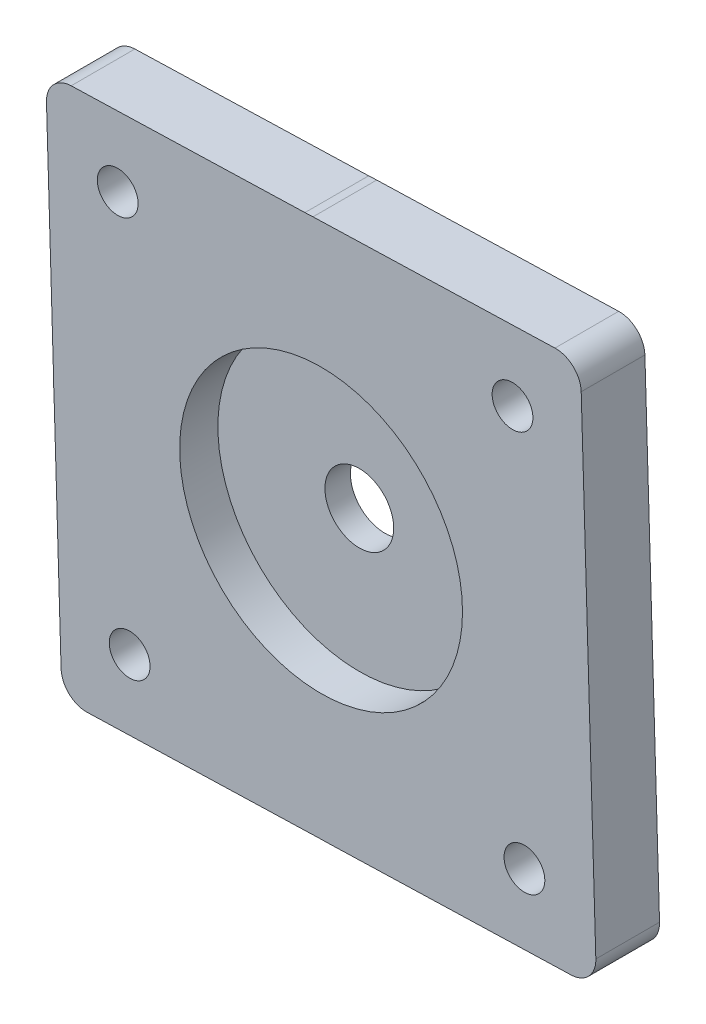
ISO-10303-21;
HEADER;
FILE_DESCRIPTION(('STEP AP214'),'2;1');
FILE_NAME('part.step','',(''),(''),'','','');
FILE_SCHEMA(('AUTOMOTIVE_DESIGN { 1 0 10303 214 1 1 1 1 }'));
ENDSEC;
DATA;
#1=APPLICATION_CONTEXT('core data for automotive mechanical design processes');
#2=APPLICATION_PROTOCOL_DEFINITION('international standard','automotive_design',2000,#1);
#3=PRODUCT_CONTEXT('',#1,'mechanical');
#4=PRODUCT('Part','Part','',(#3));
#5=PRODUCT_RELATED_PRODUCT_CATEGORY('part','',(#4));
#6=PRODUCT_DEFINITION_FORMATION('','',#4);
#7=PRODUCT_DEFINITION_CONTEXT('part definition',#1,'design');
#8=PRODUCT_DEFINITION('design','',#6,#7);
#9=PRODUCT_DEFINITION_SHAPE('','',#8);
#10=(LENGTH_UNIT() NAMED_UNIT(*) SI_UNIT(.MILLI.,.METRE.));
#11=(NAMED_UNIT(*) PLANE_ANGLE_UNIT() SI_UNIT($,.RADIAN.));
#12=(NAMED_UNIT(*) SI_UNIT($,.STERADIAN.) SOLID_ANGLE_UNIT());
#13=UNCERTAINTY_MEASURE_WITH_UNIT(LENGTH_MEASURE(1.E-05),#10,'distance_accuracy_value','');
#14=(GEOMETRIC_REPRESENTATION_CONTEXT(3) GLOBAL_UNCERTAINTY_ASSIGNED_CONTEXT((#13)) GLOBAL_UNIT_ASSIGNED_CONTEXT((#10,
#11,#12)) REPRESENTATION_CONTEXT('',''));
#15=CARTESIAN_POINT('',(0.,0.,0.));
#16=DIRECTION('',(0.,0.,1.));
#17=DIRECTION('',(1.,0.,0.));
#18=AXIS2_PLACEMENT_3D('',#15,#16,#17);
#19=CARTESIAN_POINT('',(-0.634323451040287,20.9904176651981,5.));
#20=DIRECTION('',(0.030205878620966,-0.999543698342767,0.));
#21=DIRECTION('',(0.999543698342767,0.030205878620966,0.));
#22=AXIS2_PLACEMENT_3D('',#19,#20,#21);
#23=PLANE('',#22);
#24=DIRECTION('',(-0.999543698342767,-0.030205878620966,0.));
#25=VECTOR('',#24,1.);
#26=CARTESIAN_POINT('',(-0.634323451040287,20.9904176651981,0.));
#27=LINE('',#26,#25);
#28=CARTESIAN_POINT('',(18.3570068174723,21.5643293589965,0.));
#29=VERTEX_POINT('',#28);
#30=CARTESIAN_POINT('',(-0.634323451040288,20.9904176651981,0.));
#31=VERTEX_POINT('',#30);
#32=EDGE_CURVE('E181',#29,#31,#27,.T.);
#33=ORIENTED_EDGE('',*,*,#32,.T.);
#34=DIRECTION('',(0.,0.,-1.));
#35=VECTOR('',#34,1.);
#36=CARTESIAN_POINT('',(-0.634323451040288,20.9904176651981,5.));
#37=LINE('',#36,#35);
#38=CARTESIAN_POINT('',(-0.634323451040288,20.9904176651981,5.));
#39=VERTEX_POINT('',#38);
#40=EDGE_CURVE('E11',#39,#31,#37,.T.);
#41=ORIENTED_EDGE('',*,*,#40,.F.);
#42=DIRECTION('',(-0.999543698342767,-0.030205878620966,0.));
#43=VECTOR('',#42,1.);
#44=CARTESIAN_POINT('',(-0.634323451040287,20.9904176651981,5.));
#45=LINE('',#44,#43);
#46=CARTESIAN_POINT('',(18.3570068174723,21.5643293589965,5.));
#47=VERTEX_POINT('',#46);
#48=EDGE_CURVE('E285',#47,#39,#45,.T.);
#49=ORIENTED_EDGE('',*,*,#48,.F.);
#50=DIRECTION('',(0.,0.,-1.));
#51=VECTOR('',#50,1.);
#52=CARTESIAN_POINT('',(18.3570068174723,21.5643293589965,5.));
#53=LINE('',#52,#51);
#54=EDGE_CURVE('E164',#47,#29,#53,.T.);
#55=ORIENTED_EDGE('',*,*,#54,.T.);
#56=EDGE_LOOP('',(#33,#41,#49,#55));
#57=FACE_BOUND('',#56,.T.);
#58=ADVANCED_FACE('F34',(#57),#23,.F.);
#59=CARTESIAN_POINT('',(0.,0.,5.));
#60=DIRECTION('',(0.,0.,-1.));
#61=DIRECTION('',(-1.,0.,0.));
#62=AXIS2_PLACEMENT_3D('',#59,#60,#61);
#63=CYLINDRICAL_SURFACE('',#62,21.);
#64=CARTESIAN_POINT('',(0.,0.,0.));
#65=DIRECTION('',(0.,0.,1.));
#66=DIRECTION('',(1.,0.,0.));
#67=AXIS2_PLACEMENT_3D('',#64,#65,#66);
#68=CIRCLE('',#67,21.);
#69=CARTESIAN_POINT('',(-1.26806801639639,20.9616794056629,0.));
#70=VERTEX_POINT('',#69);
#71=EDGE_CURVE('E184',#31,#70,#68,.T.);
#72=ORIENTED_EDGE('',*,*,#71,.T.);
#73=DIRECTION('',(0.,0.,-1.));
#74=VECTOR('',#73,1.);
#75=CARTESIAN_POINT('',(-1.26806801639639,20.9616794056629,5.));
#76=LINE('',#75,#74);
#77=CARTESIAN_POINT('',(-1.26806801639639,20.9616794056629,5.));
#78=VERTEX_POINT('',#77);
#79=EDGE_CURVE('E44',#78,#70,#76,.T.);
#80=ORIENTED_EDGE('',*,*,#79,.F.);
#81=CARTESIAN_POINT('',(0.,0.,5.));
#82=DIRECTION('',(0.,0.,1.));
#83=DIRECTION('',(1.,0.,0.));
#84=AXIS2_PLACEMENT_3D('',#81,#82,#83);
#85=CIRCLE('',#84,21.);
#86=EDGE_CURVE('E113',#39,#78,#85,.T.);
#87=ORIENTED_EDGE('',*,*,#86,.F.);
#88=ORIENTED_EDGE('',*,*,#40,.T.);
#89=EDGE_LOOP('',(#72,#80,#87,#88));
#90=FACE_BOUND('',#89,.T.);
#91=ADVANCED_FACE('F300',(#90),#63,.T.);
#92=CARTESIAN_POINT('',(-0.634034008198295,20.9808397028315,5.));
#93=DIRECTION('',(0.0302058786209632,-0.999543698342767,0.));
#94=DIRECTION('',(0.999543698342767,0.0302058786209632,0.));
#95=AXIS2_PLACEMENT_3D('',#92,#93,#94);
#96=PLANE('',#95);
#97=DIRECTION('',(-0.999543698342767,-0.0302058786209632,0.));
#98=VECTOR('',#97,1.);
#99=CARTESIAN_POINT('',(-0.634034008198295,20.9808397028315,0.));
#100=LINE('',#99,#98);
#101=CARTESIAN_POINT('',(-19.6157863143443,20.4072174518751,0.));
#102=VERTEX_POINT('',#101);
#103=EDGE_CURVE('E186',#70,#102,#100,.T.);
#104=ORIENTED_EDGE('',*,*,#103,.T.);
#105=DIRECTION('',(0.,0.,-1.));
#106=VECTOR('',#105,1.);
#107=CARTESIAN_POINT('',(-19.6157863143443,20.4072174518751,5.));
#108=LINE('',#107,#106);
#109=CARTESIAN_POINT('',(-19.6157863143443,20.4072174518751,5.));
#110=VERTEX_POINT('',#109);
#111=EDGE_CURVE('E232',#110,#102,#108,.T.);
#112=ORIENTED_EDGE('',*,*,#111,.F.);
#113=DIRECTION('',(-0.999543698342767,-0.0302058786209632,0.));
#114=VECTOR('',#113,1.);
#115=CARTESIAN_POINT('',(-0.634034008198295,20.9808397028315,5.));
#116=LINE('',#115,#114);
#117=EDGE_CURVE('E241',#78,#110,#116,.T.);
#118=ORIENTED_EDGE('',*,*,#117,.F.);
#119=ORIENTED_EDGE('',*,*,#79,.T.);
#120=EDGE_LOOP('',(#104,#112,#118,#119));
#121=FACE_BOUND('',#120,.T.);
#122=ADVANCED_FACE('F239',(#121),#96,.F.);
#123=CARTESIAN_POINT('',(-19.5553745571024,18.4081300551896,5.));
#124=DIRECTION('',(0.,0.,-1.));
#125=DIRECTION('',(-1.,0.,0.));
#126=AXIS2_PLACEMENT_3D('',#123,#124,#125);
#127=CYLINDRICAL_SURFACE('',#126,1.99999999999999);
#128=CARTESIAN_POINT('',(-19.5553745571024,18.4081300551896,0.));
#129=DIRECTION('',(0.,0.,1.));
#130=DIRECTION('',(1.,0.,0.));
#131=AXIS2_PLACEMENT_3D('',#128,#129,#130);
#132=CIRCLE('',#131,1.99999999999999);
#133=CARTESIAN_POINT('',(-21.5544619537879,18.3477182979476,0.));
#134=VERTEX_POINT('',#133);
#135=EDGE_CURVE('E188',#102,#134,#132,.T.);
#136=ORIENTED_EDGE('',*,*,#135,.T.);
#137=DIRECTION('',(0.,0.,-1.));
#138=VECTOR('',#137,1.);
#139=CARTESIAN_POINT('',(-21.5544619537879,18.3477182979476,5.));
#140=LINE('',#139,#138);
#141=CARTESIAN_POINT('',(-21.5544619537879,18.3477182979476,5.));
#142=VERTEX_POINT('',#141);
#143=EDGE_CURVE('E229',#142,#134,#140,.T.);
#144=ORIENTED_EDGE('',*,*,#143,.F.);
#145=CARTESIAN_POINT('',(-19.5553745571024,18.4081300551896,5.));
#146=DIRECTION('',(0.,0.,1.));
#147=DIRECTION('',(1.,0.,0.));
#148=AXIS2_PLACEMENT_3D('',#145,#146,#147);
#149=CIRCLE('',#148,1.99999999999999);
#150=EDGE_CURVE('E259',#110,#142,#149,.T.);
#151=ORIENTED_EDGE('',*,*,#150,.F.);
#152=ORIENTED_EDGE('',*,*,#111,.T.);
#153=EDGE_LOOP('',(#136,#144,#151,#152));
#154=FACE_BOUND('',#153,.T.);
#155=ADVANCED_FACE('F250',(#154),#127,.T.);
#156=CARTESIAN_POINT('',(-20.9808397028314,-0.6340340081984,5.));
#157=DIRECTION('',(0.999543698342767,0.0302058786209682,0.));
#158=DIRECTION('',(-0.0302058786209682,0.999543698342767,0.));
#159=AXIS2_PLACEMENT_3D('',#156,#157,#158);
#160=PLANE('',#159);
#161=DIRECTION('',(0.0302058786209682,-0.999543698342767,0.));
#162=VECTOR('',#161,1.);
#163=CARTESIAN_POINT('',(-20.9808397028314,-0.6340340081984,0.));
#164=LINE('',#163,#162);
#165=CARTESIAN_POINT('',(-21.,0.,0.));
#166=VERTEX_POINT('',#165);
#167=EDGE_CURVE('E190',#134,#166,#164,.T.);
#168=ORIENTED_EDGE('',*,*,#167,.T.);
#169=DIRECTION('',(0.,0.,-1.));
#170=VECTOR('',#169,1.);
#171=CARTESIAN_POINT('',(-21.,0.,5.));
#172=LINE('',#171,#170);
#173=CARTESIAN_POINT('',(-21.,0.,5.));
#174=VERTEX_POINT('',#173);
#175=EDGE_CURVE('E226',#174,#166,#172,.T.);
#176=ORIENTED_EDGE('',*,*,#175,.F.);
#177=DIRECTION('',(0.0302058786209682,-0.999543698342767,0.));
#178=VECTOR('',#177,1.);
#179=CARTESIAN_POINT('',(-20.9808397028314,-0.6340340081984,5.));
#180=LINE('',#179,#178);
#181=EDGE_CURVE('E256',#142,#174,#180,.T.);
#182=ORIENTED_EDGE('',*,*,#181,.F.);
#183=ORIENTED_EDGE('',*,*,#143,.T.);
#184=EDGE_LOOP('',(#168,#176,#182,#183));
#185=FACE_BOUND('',#184,.T.);
#186=ADVANCED_FACE('F254',(#185),#160,.F.);
#187=CARTESIAN_POINT('',(0.,0.,5.));
#188=DIRECTION('',(0.,0.,-1.));
#189=DIRECTION('',(-1.,0.,0.));
#190=AXIS2_PLACEMENT_3D('',#187,#188,#189);
#191=CYLINDRICAL_SURFACE('',#190,21.);
#192=CARTESIAN_POINT('',(0.,0.,0.));
#193=DIRECTION('',(0.,0.,1.));
#194=DIRECTION('',(1.,0.,0.));
#195=AXIS2_PLACEMENT_3D('',#192,#193,#194);
#196=CIRCLE('',#195,21.);
#197=CARTESIAN_POINT('',(-20.9616794056629,-1.26806801639672,0.));
#198=VERTEX_POINT('',#197);
#199=EDGE_CURVE('E192',#166,#198,#196,.T.);
#200=ORIENTED_EDGE('',*,*,#199,.T.);
#201=DIRECTION('',(0.,0.,-1.));
#202=VECTOR('',#201,1.);
#203=CARTESIAN_POINT('',(-20.9616794056629,-1.26806801639672,5.));
#204=LINE('',#203,#202);
#205=CARTESIAN_POINT('',(-20.9616794056629,-1.26806801639672,5.));
#206=VERTEX_POINT('',#205);
#207=EDGE_CURVE('E223',#206,#198,#204,.T.);
#208=ORIENTED_EDGE('',*,*,#207,.F.);
#209=CARTESIAN_POINT('',(0.,0.,5.));
#210=DIRECTION('',(0.,0.,1.));
#211=DIRECTION('',(1.,0.,0.));
#212=AXIS2_PLACEMENT_3D('',#209,#210,#211);
#213=CIRCLE('',#212,21.);
#214=EDGE_CURVE('E258',#174,#206,#213,.T.);
#215=ORIENTED_EDGE('',*,*,#214,.F.);
#216=ORIENTED_EDGE('',*,*,#175,.T.);
#217=EDGE_LOOP('',(#200,#208,#215,#216));
#218=FACE_BOUND('',#217,.T.);
#219=ADVANCED_FACE('F482',(#218),#191,.T.);
#220=CARTESIAN_POINT('',(-20.9808397028314,-0.634034008198408,5.));
#221=DIRECTION('',(0.999543698342767,0.0302058786209685,0.));
#222=DIRECTION('',(-0.0302058786209685,0.999543698342767,0.));
#223=AXIS2_PLACEMENT_3D('',#220,#221,#222);
#224=PLANE('',#223);
#225=DIRECTION('',(0.0302058786209685,-0.999543698342767,0.));
#226=VECTOR('',#225,1.);
#227=CARTESIAN_POINT('',(-20.9808397028314,-0.634034008198408,0.));
#228=LINE('',#227,#226);
#229=CARTESIAN_POINT('',(-20.4072174219756,-19.6157873037472,0.));
#230=VERTEX_POINT('',#229);
#231=EDGE_CURVE('E194',#198,#230,#228,.T.);
#232=ORIENTED_EDGE('',*,*,#231,.T.);
#233=DIRECTION('',(0.,0.,-1.));
#234=VECTOR('',#233,1.);
#235=CARTESIAN_POINT('',(-20.4072174219756,-19.6157873037472,5.));
#236=LINE('',#235,#234);
#237=CARTESIAN_POINT('',(-20.4072174219756,-19.6157873037472,5.));
#238=VERTEX_POINT('',#237);
#239=EDGE_CURVE('E220',#238,#230,#236,.T.);
#240=ORIENTED_EDGE('',*,*,#239,.F.);
#241=DIRECTION('',(0.0302058786209685,-0.999543698342767,0.));
#242=VECTOR('',#241,1.);
#243=CARTESIAN_POINT('',(-20.9808397028314,-0.634034008198408,5.));
#244=LINE('',#243,#242);
#245=EDGE_CURVE('E261',#206,#238,#244,.T.);
#246=ORIENTED_EDGE('',*,*,#245,.F.);
#247=ORIENTED_EDGE('',*,*,#207,.T.);
#248=EDGE_LOOP('',(#232,#240,#246,#247));
#249=FACE_BOUND('',#248,.T.);
#250=ADVANCED_FACE('F473',(#249),#224,.F.);
#251=CARTESIAN_POINT('',(-18.40813002529,-19.5553755465053,5.));
#252=DIRECTION('',(0.,0.,-1.));
#253=DIRECTION('',(-1.,0.,0.));
#254=AXIS2_PLACEMENT_3D('',#251,#252,#253);
#255=CYLINDRICAL_SURFACE('',#254,2.);
#256=CARTESIAN_POINT('',(-18.40813002529,-19.5553755465053,0.));
#257=DIRECTION('',(0.,0.,1.));
#258=DIRECTION('',(1.,0.,0.));
#259=AXIS2_PLACEMENT_3D('',#256,#257,#258);
#260=CIRCLE('',#259,2.);
#261=CARTESIAN_POINT('',(-18.3477181602471,-21.5544629399331,0.));
#262=VERTEX_POINT('',#261);
#263=EDGE_CURVE('E196',#230,#262,#260,.T.);
#264=ORIENTED_EDGE('',*,*,#263,.T.);
#265=DIRECTION('',(0.,0.,-1.));
#266=VECTOR('',#265,1.);
#267=CARTESIAN_POINT('',(-18.3477181602471,-21.5544629399331,5.));
#268=LINE('',#267,#266);
#269=CARTESIAN_POINT('',(-18.3477181602471,-21.5544629399331,5.));
#270=VERTEX_POINT('',#269);
#271=EDGE_CURVE('E217',#270,#262,#268,.T.);
#272=ORIENTED_EDGE('',*,*,#271,.F.);
#273=CARTESIAN_POINT('',(-18.40813002529,-19.5553755465053,5.));
#274=DIRECTION('',(0.,0.,1.));
#275=DIRECTION('',(1.,0.,0.));
#276=AXIS2_PLACEMENT_3D('',#273,#274,#275);
#277=CIRCLE('',#276,2.);
#278=EDGE_CURVE('E267',#238,#270,#277,.T.);
#279=ORIENTED_EDGE('',*,*,#278,.F.);
#280=ORIENTED_EDGE('',*,*,#239,.T.);
#281=EDGE_LOOP('',(#264,#272,#279,#280));
#282=FACE_BOUND('',#281,.T.);
#283=ADVANCED_FACE('F464',(#282),#255,.T.);
#284=CARTESIAN_POINT('',(0.634035138559485,-20.9808396344507,5.));
#285=DIRECTION('',(-0.0302059325214825,0.999543696713909,0.));
#286=DIRECTION('',(-0.999543696713909,-0.0302059325214825,0.));
#287=AXIS2_PLACEMENT_3D('',#284,#285,#286);
#288=PLANE('',#287);
#289=DIRECTION('',(0.999543696713909,0.0302059325214825,0.));
#290=VECTOR('',#289,1.);
#291=CARTESIAN_POINT('',(0.634035138559485,-20.9808396344507,0.));
#292=LINE('',#291,#290);
#293=CARTESIAN_POINT('',(0.,-21.,0.));
#294=VERTEX_POINT('',#293);
#295=EDGE_CURVE('E198',#262,#294,#292,.T.);
#296=ORIENTED_EDGE('',*,*,#295,.T.);
#297=DIRECTION('',(0.,0.,-1.));
#298=VECTOR('',#297,1.);
#299=CARTESIAN_POINT('',(0.,-21.,5.));
#300=LINE('',#299,#298);
#301=CARTESIAN_POINT('',(0.,-21.,5.));
#302=VERTEX_POINT('',#301);
#303=EDGE_CURVE('E214',#302,#294,#300,.T.);
#304=ORIENTED_EDGE('',*,*,#303,.F.);
#305=DIRECTION('',(0.999543696713909,0.0302059325214825,0.));
#306=VECTOR('',#305,1.);
#307=CARTESIAN_POINT('',(0.634035138559485,-20.9808396344507,5.));
#308=LINE('',#307,#306);
#309=EDGE_CURVE('E269',#270,#302,#308,.T.);
#310=ORIENTED_EDGE('',*,*,#309,.F.);
#311=ORIENTED_EDGE('',*,*,#271,.T.);
#312=EDGE_LOOP('',(#296,#304,#310,#311));
#313=FACE_BOUND('',#312,.T.);
#314=ADVANCED_FACE('F456',(#313),#288,.F.);
#315=CARTESIAN_POINT('',(0.,0.,5.));
#316=DIRECTION('',(0.,0.,-1.));
#317=DIRECTION('',(-1.,0.,0.));
#318=AXIS2_PLACEMENT_3D('',#315,#316,#317);
#319=CYLINDRICAL_SURFACE('',#318,21.);
#320=CARTESIAN_POINT('',(0.,0.,0.));
#321=DIRECTION('',(0.,0.,1.));
#322=DIRECTION('',(1.,0.,0.));
#323=AXIS2_PLACEMENT_3D('',#320,#321,#322);
#324=CIRCLE('',#323,21.);
#325=CARTESIAN_POINT('',(0.634323451040263,-20.9904176651981,0.));
#326=VERTEX_POINT('',#325);
#327=EDGE_CURVE('E200',#294,#326,#324,.T.);
#328=ORIENTED_EDGE('',*,*,#327,.T.);
#329=DIRECTION('',(0.,0.,-1.));
#330=VECTOR('',#329,1.);
#331=CARTESIAN_POINT('',(0.634323451040263,-20.9904176651981,5.));
#332=LINE('',#331,#330);
#333=CARTESIAN_POINT('',(0.634323451040263,-20.9904176651981,5.));
#334=VERTEX_POINT('',#333);
#335=EDGE_CURVE('E211',#334,#326,#332,.T.);
#336=ORIENTED_EDGE('',*,*,#335,.F.);
#337=CARTESIAN_POINT('',(0.,0.,5.));
#338=DIRECTION('',(0.,0.,1.));
#339=DIRECTION('',(1.,0.,0.));
#340=AXIS2_PLACEMENT_3D('',#337,#338,#339);
#341=CIRCLE('',#340,21.);
#342=EDGE_CURVE('E271',#302,#334,#341,.T.);
#343=ORIENTED_EDGE('',*,*,#342,.F.);
#344=ORIENTED_EDGE('',*,*,#303,.T.);
#345=EDGE_LOOP('',(#328,#336,#343,#344));
#346=FACE_BOUND('',#345,.T.);
#347=ADVANCED_FACE('F277',(#346),#319,.T.);
#348=CARTESIAN_POINT('',(0.634323451040271,-20.9904176651981,5.));
#349=DIRECTION('',(-0.0302058786209653,0.999543698342767,0.));
#350=DIRECTION('',(-0.999543698342767,-0.0302058786209653,0.));
#351=AXIS2_PLACEMENT_3D('',#348,#349,#350);
#352=PLANE('',#351);
#353=DIRECTION('',(0.999543698342767,0.0302058786209653,0.));
#354=VECTOR('',#353,1.);
#355=CARTESIAN_POINT('',(0.634323451040271,-20.9904176651981,0.));
#356=LINE('',#355,#354);
#357=CARTESIAN_POINT('',(19.6256537195529,-20.4165059713998,0.));
#358=VERTEX_POINT('',#357);
#359=EDGE_CURVE('E202',#326,#358,#356,.T.);
#360=ORIENTED_EDGE('',*,*,#359,.T.);
#361=DIRECTION('',(0.,0.,-1.));
#362=VECTOR('',#361,1.);
#363=CARTESIAN_POINT('',(19.6256537195529,-20.4165059713998,5.));
#364=LINE('',#363,#362);
#365=CARTESIAN_POINT('',(19.6256537195529,-20.4165059713998,5.));
#366=VERTEX_POINT('',#365);
#367=EDGE_CURVE('E159',#366,#358,#364,.T.);
#368=ORIENTED_EDGE('',*,*,#367,.F.);
#369=DIRECTION('',(0.999543698342767,0.0302058786209653,0.));
#370=VECTOR('',#369,1.);
#371=CARTESIAN_POINT('',(0.634323451040271,-20.9904176651981,5.));
#372=LINE('',#371,#370);
#373=EDGE_CURVE('E150',#334,#366,#372,.T.);
#374=ORIENTED_EDGE('',*,*,#373,.F.);
#375=ORIENTED_EDGE('',*,*,#335,.T.);
#376=EDGE_LOOP('',(#360,#368,#374,#375));
#377=FACE_BOUND('',#376,.T.);
#378=ADVANCED_FACE('F281',(#377),#352,.F.);
#379=CARTESIAN_POINT('',(19.5652419623109,-18.4174185747142,5.));
#380=DIRECTION('',(0.,0.,-1.));
#381=DIRECTION('',(-1.,0.,0.));
#382=AXIS2_PLACEMENT_3D('',#379,#380,#381);
#383=CYLINDRICAL_SURFACE('',#382,2.);
#384=CARTESIAN_POINT('',(19.5652419623109,-18.4174185747142,0.));
#385=DIRECTION('',(0.,0.,1.));
#386=DIRECTION('',(1.,0.,0.));
#387=AXIS2_PLACEMENT_3D('',#384,#385,#386);
#388=CIRCLE('',#387,2.);
#389=CARTESIAN_POINT('',(21.5643293589965,-18.3570068174723,0.));
#390=VERTEX_POINT('',#389);
#391=EDGE_CURVE('E158',#358,#390,#388,.T.);
#392=ORIENTED_EDGE('',*,*,#391,.T.);
#393=DIRECTION('',(0.,0.,-1.));
#394=VECTOR('',#393,1.);
#395=CARTESIAN_POINT('',(21.5643293589965,-18.3570068174723,5.));
#396=LINE('',#395,#394);
#397=CARTESIAN_POINT('',(21.5643293589965,-18.3570068174723,5.));
#398=VERTEX_POINT('',#397);
#399=EDGE_CURVE('E155',#398,#390,#396,.T.);
#400=ORIENTED_EDGE('',*,*,#399,.F.);
#401=CARTESIAN_POINT('',(19.5652419623109,-18.4174185747142,5.));
#402=DIRECTION('',(0.,0.,1.));
#403=DIRECTION('',(1.,0.,0.));
#404=AXIS2_PLACEMENT_3D('',#401,#402,#403);
#405=CIRCLE('',#404,2.);
#406=EDGE_CURVE('E144',#366,#398,#405,.T.);
#407=ORIENTED_EDGE('',*,*,#406,.F.);
#408=ORIENTED_EDGE('',*,*,#367,.T.);
#409=EDGE_LOOP('',(#392,#400,#407,#408));
#410=FACE_BOUND('',#409,.T.);
#411=ADVANCED_FACE('F156',(#410),#383,.T.);
#412=CARTESIAN_POINT('',(20.9904176651981,0.634323451040286,5.));
#413=DIRECTION('',(-0.999543698342767,-0.030205878620966,0.));
#414=DIRECTION('',(0.030205878620966,-0.999543698342767,0.));
#415=AXIS2_PLACEMENT_3D('',#412,#413,#414);
#416=PLANE('',#415);
#417=DIRECTION('',(-0.030205878620966,0.999543698342767,0.));
#418=VECTOR('',#417,1.);
#419=CARTESIAN_POINT('',(20.9904176651981,0.634323451040286,0.));
#420=LINE('',#419,#418);
#421=CARTESIAN_POINT('',(20.4165059713998,19.6256537195529,0.));
#422=VERTEX_POINT('',#421);
#423=EDGE_CURVE('E99',#390,#422,#420,.T.);
#424=ORIENTED_EDGE('',*,*,#423,.T.);
#425=DIRECTION('',(0.,0.,-1.));
#426=VECTOR('',#425,1.);
#427=CARTESIAN_POINT('',(20.4165059713998,19.6256537195529,5.));
#428=LINE('',#427,#426);
#429=CARTESIAN_POINT('',(20.4165059713998,19.6256537195529,5.));
#430=VERTEX_POINT('',#429);
#431=EDGE_CURVE('E160',#430,#422,#428,.T.);
#432=ORIENTED_EDGE('',*,*,#431,.F.);
#433=DIRECTION('',(-0.030205878620966,0.999543698342767,0.));
#434=VECTOR('',#433,1.);
#435=CARTESIAN_POINT('',(20.9904176651981,0.634323451040286,5.));
#436=LINE('',#435,#434);
#437=EDGE_CURVE('E148',#398,#430,#436,.T.);
#438=ORIENTED_EDGE('',*,*,#437,.F.);
#439=ORIENTED_EDGE('',*,*,#399,.T.);
#440=EDGE_LOOP('',(#424,#432,#438,#439));
#441=FACE_BOUND('',#440,.T.);
#442=ADVANCED_FACE('F162',(#441),#416,.F.);
#443=CARTESIAN_POINT('',(-15.9611184429586,15.0247362056726,5.));
#444=DIRECTION('',(0.,0.,-1.));
#445=DIRECTION('',(-1.,0.,0.));
#446=AXIS2_PLACEMENT_3D('',#443,#444,#445);
#447=CYLINDRICAL_SURFACE('',#446,1.60000000000021);
#448=CARTESIAN_POINT('',(-15.9611184429586,15.0247362056726,5.));
#449=DIRECTION('',(0.,0.,1.));
#450=DIRECTION('',(1.,0.,0.));
#451=AXIS2_PLACEMENT_3D('',#448,#449,#450);
#452=CIRCLE('',#451,1.60000000000021);
#453=CARTESIAN_POINT('',(-14.3611184429584,15.0247362056726,5.));
#454=VERTEX_POINT('',#453);
#455=EDGE_CURVE('E369',#454,#454,#452,.T.);
#456=ORIENTED_EDGE('',*,*,#455,.T.);
#457=EDGE_LOOP('',(#456));
#458=FACE_BOUND('',#457,.T.);
#459=CARTESIAN_POINT('',(-15.9611184429586,15.0247362056726,0.));
#460=DIRECTION('',(0.,0.,1.));
#461=DIRECTION('',(1.,0.,0.));
#462=AXIS2_PLACEMENT_3D('',#459,#460,#461);
#463=CIRCLE('',#462,1.60000000000021);
#464=CARTESIAN_POINT('',(-14.3611184429584,15.0247362056726,0.));
#465=VERTEX_POINT('',#464);
#466=EDGE_CURVE('E178',#465,#465,#463,.T.);
#467=ORIENTED_EDGE('',*,*,#466,.F.);
#468=EDGE_LOOP('',(#467));
#469=FACE_BOUND('',#468,.T.);
#470=ADVANCED_FACE('F308',(#458,#469),#447,.F.);
#471=CARTESIAN_POINT('',(-15.0247362056717,-15.9611184429586,5.));
#472=DIRECTION('',(0.,0.,-1.));
#473=DIRECTION('',(-1.,0.,0.));
#474=AXIS2_PLACEMENT_3D('',#471,#472,#473);
#475=CYLINDRICAL_SURFACE('',#474,1.60000000000065);
#476=CARTESIAN_POINT('',(-15.0247362056717,-15.9611184429586,5.));
#477=DIRECTION('',(0.,0.,1.));
#478=DIRECTION('',(1.,0.,0.));
#479=AXIS2_PLACEMENT_3D('',#476,#477,#478);
#480=CIRCLE('',#479,1.60000000000065);
#481=CARTESIAN_POINT('',(-13.424736205671,-15.9611184429586,5.));
#482=VERTEX_POINT('',#481);
#483=EDGE_CURVE('E366',#482,#482,#480,.T.);
#484=ORIENTED_EDGE('',*,*,#483,.T.);
#485=EDGE_LOOP('',(#484));
#486=FACE_BOUND('',#485,.T.);
#487=CARTESIAN_POINT('',(-15.0247362056717,-15.9611184429586,0.));
#488=DIRECTION('',(0.,0.,1.));
#489=DIRECTION('',(1.,0.,0.));
#490=AXIS2_PLACEMENT_3D('',#487,#488,#489);
#491=CIRCLE('',#490,1.60000000000065);
#492=CARTESIAN_POINT('',(-13.424736205671,-15.9611184429586,0.));
#493=VERTEX_POINT('',#492);
#494=EDGE_CURVE('E175',#493,#493,#491,.T.);
#495=ORIENTED_EDGE('',*,*,#494,.F.);
#496=EDGE_LOOP('',(#495));
#497=FACE_BOUND('',#496,.T.);
#498=ADVANCED_FACE('F311',(#486,#497),#475,.F.);
#499=CARTESIAN_POINT('',(15.9611184429595,-15.0247362056717,5.));
#500=DIRECTION('',(0.,0.,-1.));
#501=DIRECTION('',(-1.,0.,0.));
#502=AXIS2_PLACEMENT_3D('',#499,#500,#501);
#503=CYLINDRICAL_SURFACE('',#502,1.60000000000143);
#504=CARTESIAN_POINT('',(15.9611184429595,-15.0247362056717,5.));
#505=DIRECTION('',(0.,0.,1.));
#506=DIRECTION('',(1.,0.,0.));
#507=AXIS2_PLACEMENT_3D('',#504,#505,#506);
#508=CIRCLE('',#507,1.60000000000143);
#509=CARTESIAN_POINT('',(17.5611184429609,-15.0247362056717,5.));
#510=VERTEX_POINT('',#509);
#511=EDGE_CURVE('E322',#510,#510,#508,.T.);
#512=ORIENTED_EDGE('',*,*,#511,.T.);
#513=EDGE_LOOP('',(#512));
#514=FACE_BOUND('',#513,.T.);
#515=CARTESIAN_POINT('',(15.9611184429595,-15.0247362056717,0.));
#516=DIRECTION('',(0.,0.,1.));
#517=DIRECTION('',(1.,0.,0.));
#518=AXIS2_PLACEMENT_3D('',#515,#516,#517);
#519=CIRCLE('',#518,1.60000000000143);
#520=CARTESIAN_POINT('',(17.5611184429609,-15.0247362056717,0.));
#521=VERTEX_POINT('',#520);
#522=EDGE_CURVE('E171',#521,#521,#519,.T.);
#523=ORIENTED_EDGE('',*,*,#522,.F.);
#524=EDGE_LOOP('',(#523));
#525=FACE_BOUND('',#524,.T.);
#526=ADVANCED_FACE('F295',(#514,#525),#503,.F.);
#527=CARTESIAN_POINT('',(15.0247362056725,15.9611184429595,5.));
#528=DIRECTION('',(0.,0.,-1.));
#529=DIRECTION('',(-1.,0.,0.));
#530=AXIS2_PLACEMENT_3D('',#527,#528,#529);
#531=CYLINDRICAL_SURFACE('',#530,1.60000000000112);
#532=CARTESIAN_POINT('',(15.0247362056725,15.9611184429595,5.));
#533=DIRECTION('',(0.,0.,1.));
#534=DIRECTION('',(1.,0.,0.));
#535=AXIS2_PLACEMENT_3D('',#532,#533,#534);
#536=CIRCLE('',#535,1.60000000000112);
#537=CARTESIAN_POINT('',(16.6247362056737,15.9611184429595,5.));
#538=VERTEX_POINT('',#537);
#539=EDGE_CURVE('E207',#538,#538,#536,.T.);
#540=ORIENTED_EDGE('',*,*,#539,.T.);
#541=EDGE_LOOP('',(#540));
#542=FACE_BOUND('',#541,.T.);
#543=CARTESIAN_POINT('',(15.0247362056725,15.9611184429595,0.));
#544=DIRECTION('',(0.,0.,1.));
#545=DIRECTION('',(1.,0.,0.));
#546=AXIS2_PLACEMENT_3D('',#543,#544,#545);
#547=CIRCLE('',#546,1.60000000000112);
#548=CARTESIAN_POINT('',(16.6247362056737,15.9611184429595,0.));
#549=VERTEX_POINT('',#548);
#550=EDGE_CURVE('E168',#549,#549,#547,.T.);
#551=ORIENTED_EDGE('',*,*,#550,.F.);
#552=EDGE_LOOP('',(#551));
#553=FACE_BOUND('',#552,.T.);
#554=ADVANCED_FACE('F36',(#542,#553),#531,.F.);
#555=CARTESIAN_POINT('',(18.4174185747142,19.5652419623109,5.));
#556=DIRECTION('',(0.,0.,-1.));
#557=DIRECTION('',(-1.,0.,0.));
#558=AXIS2_PLACEMENT_3D('',#555,#556,#557);
#559=CYLINDRICAL_SURFACE('',#558,2.);
#560=CARTESIAN_POINT('',(18.4174185747142,19.5652419623109,0.));
#561=DIRECTION('',(0.,0.,1.));
#562=DIRECTION('',(1.,0.,0.));
#563=AXIS2_PLACEMENT_3D('',#560,#561,#562);
#564=CIRCLE('',#563,2.);
#565=EDGE_CURVE('E105',#422,#29,#564,.T.);
#566=ORIENTED_EDGE('',*,*,#565,.T.);
#567=ORIENTED_EDGE('',*,*,#54,.F.);
#568=CARTESIAN_POINT('',(18.4174185747142,19.5652419623109,5.));
#569=DIRECTION('',(0.,0.,1.));
#570=DIRECTION('',(1.,0.,0.));
#571=AXIS2_PLACEMENT_3D('',#568,#569,#570);
#572=CIRCLE('',#571,2.);
#573=EDGE_CURVE('E52',#430,#47,#572,.T.);
#574=ORIENTED_EDGE('',*,*,#573,.F.);
#575=ORIENTED_EDGE('',*,*,#431,.T.);
#576=EDGE_LOOP('',(#566,#567,#574,#575));
#577=FACE_BOUND('',#576,.T.);
#578=ADVANCED_FACE('F286',(#577),#559,.T.);
#579=CARTESIAN_POINT('',(0.,0.,5.));
#580=DIRECTION('',(0.,0.,1.));
#581=DIRECTION('',(1.,0.,0.));
#582=AXIS2_PLACEMENT_3D('',#579,#580,#581);
#583=PLANE('',#582);
#584=CARTESIAN_POINT('',(0.,0.,5.));
#585=DIRECTION('',(0.,0.,1.));
#586=DIRECTION('',(1.,0.,0.));
#587=AXIS2_PLACEMENT_3D('',#584,#585,#586);
#588=CIRCLE('',#587,11.1);
#589=CARTESIAN_POINT('',(11.1,0.,5.));
#590=VERTEX_POINT('',#589);
#591=EDGE_CURVE('E356',#590,#590,#588,.T.);
#592=ORIENTED_EDGE('',*,*,#591,.F.);
#593=EDGE_LOOP('',(#592));
#594=FACE_BOUND('',#593,.T.);
#595=ORIENTED_EDGE('',*,*,#539,.F.);
#596=EDGE_LOOP('',(#595));
#597=FACE_BOUND('',#596,.T.);
#598=ORIENTED_EDGE('',*,*,#511,.F.);
#599=EDGE_LOOP('',(#598));
#600=FACE_BOUND('',#599,.T.);
#601=ORIENTED_EDGE('',*,*,#483,.F.);
#602=EDGE_LOOP('',(#601));
#603=FACE_BOUND('',#602,.T.);
#604=ORIENTED_EDGE('',*,*,#455,.F.);
#605=EDGE_LOOP('',(#604));
#606=FACE_BOUND('',#605,.T.);
#607=ORIENTED_EDGE('',*,*,#48,.T.);
#608=ORIENTED_EDGE('',*,*,#86,.T.);
#609=ORIENTED_EDGE('',*,*,#117,.T.);
#610=ORIENTED_EDGE('',*,*,#150,.T.);
#611=ORIENTED_EDGE('',*,*,#181,.T.);
#612=ORIENTED_EDGE('',*,*,#214,.T.);
#613=ORIENTED_EDGE('',*,*,#245,.T.);
#614=ORIENTED_EDGE('',*,*,#278,.T.);
#615=ORIENTED_EDGE('',*,*,#309,.T.);
#616=ORIENTED_EDGE('',*,*,#342,.T.);
#617=ORIENTED_EDGE('',*,*,#373,.T.);
#618=ORIENTED_EDGE('',*,*,#406,.T.);
#619=ORIENTED_EDGE('',*,*,#437,.T.);
#620=ORIENTED_EDGE('',*,*,#573,.T.);
#621=EDGE_LOOP('',(#607,#608,#609,#610,#611,#612,#613,#614,#615,#616,#617,#618,#619,#620));
#622=FACE_BOUND('',#621,.T.);
#623=ADVANCED_FACE('F146',(#594,#597,#600,#603,#606,#622),#583,.T.);
#624=CARTESIAN_POINT('',(0.,0.,0.));
#625=DIRECTION('',(0.,0.,1.));
#626=DIRECTION('',(1.,0.,0.));
#627=AXIS2_PLACEMENT_3D('',#624,#625,#626);
#628=PLANE('',#627);
#629=CARTESIAN_POINT('',(0.,0.,0.));
#630=DIRECTION('',(0.,0.,1.));
#631=DIRECTION('',(1.,0.,0.));
#632=AXIS2_PLACEMENT_3D('',#629,#630,#631);
#633=CIRCLE('',#632,2.7);
#634=CARTESIAN_POINT('',(2.7,0.,0.));
#635=VERTEX_POINT('',#634);
#636=EDGE_CURVE('E38',#635,#635,#633,.T.);
#637=ORIENTED_EDGE('',*,*,#636,.T.);
#638=EDGE_LOOP('',(#637));
#639=FACE_BOUND('',#638,.T.);
#640=ORIENTED_EDGE('',*,*,#550,.T.);
#641=EDGE_LOOP('',(#640));
#642=FACE_BOUND('',#641,.T.);
#643=ORIENTED_EDGE('',*,*,#522,.T.);
#644=EDGE_LOOP('',(#643));
#645=FACE_BOUND('',#644,.T.);
#646=ORIENTED_EDGE('',*,*,#494,.T.);
#647=EDGE_LOOP('',(#646));
#648=FACE_BOUND('',#647,.T.);
#649=ORIENTED_EDGE('',*,*,#466,.T.);
#650=EDGE_LOOP('',(#649));
#651=FACE_BOUND('',#650,.T.);
#652=ORIENTED_EDGE('',*,*,#32,.F.);
#653=ORIENTED_EDGE('',*,*,#565,.F.);
#654=ORIENTED_EDGE('',*,*,#423,.F.);
#655=ORIENTED_EDGE('',*,*,#391,.F.);
#656=ORIENTED_EDGE('',*,*,#359,.F.);
#657=ORIENTED_EDGE('',*,*,#327,.F.);
#658=ORIENTED_EDGE('',*,*,#295,.F.);
#659=ORIENTED_EDGE('',*,*,#263,.F.);
#660=ORIENTED_EDGE('',*,*,#231,.F.);
#661=ORIENTED_EDGE('',*,*,#199,.F.);
#662=ORIENTED_EDGE('',*,*,#167,.F.);
#663=ORIENTED_EDGE('',*,*,#135,.F.);
#664=ORIENTED_EDGE('',*,*,#103,.F.);
#665=ORIENTED_EDGE('',*,*,#71,.F.);
#666=EDGE_LOOP('',(#652,#653,#654,#655,#656,#657,#658,#659,#660,#661,#662,#663,#664,#665));
#667=FACE_BOUND('',#666,.T.);
#668=ADVANCED_FACE('F245',(#639,#642,#645,#648,#651,#667),#628,.F.);
#669=CARTESIAN_POINT('',(0.,0.,2.));
#670=DIRECTION('',(0.,0.,1.));
#671=DIRECTION('',(1.,0.,0.));
#672=AXIS2_PLACEMENT_3D('',#669,#670,#671);
#673=CYLINDRICAL_SURFACE('',#672,11.1);
#674=CARTESIAN_POINT('',(0.,0.,2.));
#675=DIRECTION('',(0.,0.,1.));
#676=DIRECTION('',(1.,0.,0.));
#677=AXIS2_PLACEMENT_3D('',#674,#675,#676);
#678=CIRCLE('',#677,11.1);
#679=CARTESIAN_POINT('',(11.1,0.,2.));
#680=VERTEX_POINT('',#679);
#681=EDGE_CURVE('E172',#680,#680,#678,.T.);
#682=ORIENTED_EDGE('',*,*,#681,.F.);
#683=EDGE_LOOP('',(#682));
#684=FACE_BOUND('',#683,.T.);
#685=ORIENTED_EDGE('',*,*,#591,.T.);
#686=EDGE_LOOP('',(#685));
#687=FACE_BOUND('',#686,.T.);
#688=ADVANCED_FACE('F327',(#684,#687),#673,.F.);
#689=CARTESIAN_POINT('',(0.,0.,2.));
#690=DIRECTION('',(0.,0.,1.));
#691=DIRECTION('',(1.,0.,0.));
#692=AXIS2_PLACEMENT_3D('',#689,#690,#691);
#693=PLANE('',#692);
#694=CARTESIAN_POINT('',(0.,0.,2.));
#695=DIRECTION('',(0.,0.,1.));
#696=DIRECTION('',(1.,0.,0.));
#697=AXIS2_PLACEMENT_3D('',#694,#695,#696);
#698=CIRCLE('',#697,2.7);
#699=CARTESIAN_POINT('',(2.7,0.,2.));
#700=VERTEX_POINT('',#699);
#701=EDGE_CURVE('E354',#700,#700,#698,.T.);
#702=ORIENTED_EDGE('',*,*,#701,.F.);
#703=EDGE_LOOP('',(#702));
#704=FACE_BOUND('',#703,.T.);
#705=ORIENTED_EDGE('',*,*,#681,.T.);
#706=EDGE_LOOP('',(#705));
#707=FACE_BOUND('',#706,.T.);
#708=ADVANCED_FACE('F337',(#704,#707),#693,.T.);
#709=CARTESIAN_POINT('',(0.,0.,-1.));
#710=DIRECTION('',(0.,0.,1.));
#711=DIRECTION('',(1.,0.,0.));
#712=AXIS2_PLACEMENT_3D('',#709,#710,#711);
#713=CYLINDRICAL_SURFACE('',#712,2.7);
#714=ORIENTED_EDGE('',*,*,#701,.T.);
#715=EDGE_LOOP('',(#714));
#716=FACE_BOUND('',#715,.T.);
#717=ORIENTED_EDGE('',*,*,#636,.F.);
#718=EDGE_LOOP('',(#717));
#719=FACE_BOUND('',#718,.T.);
#720=ADVANCED_FACE('F345',(#716,#719),#713,.F.);
#721=CLOSED_SHELL('',(#58,#91,#122,#155,#186,#219,#250,#283,#314,#347,#378,#411,#442,#470,#498,
#526,#554,#578,#623,#668,#688,#708,#720));
#722=MANIFOLD_SOLID_BREP('B2',#721);
#723=ADVANCED_BREP_SHAPE_REPRESENTATION('',(#18,#722),#14);
#724=SHAPE_DEFINITION_REPRESENTATION(#9,#723);
ENDSEC;
END-ISO-10303-21;
